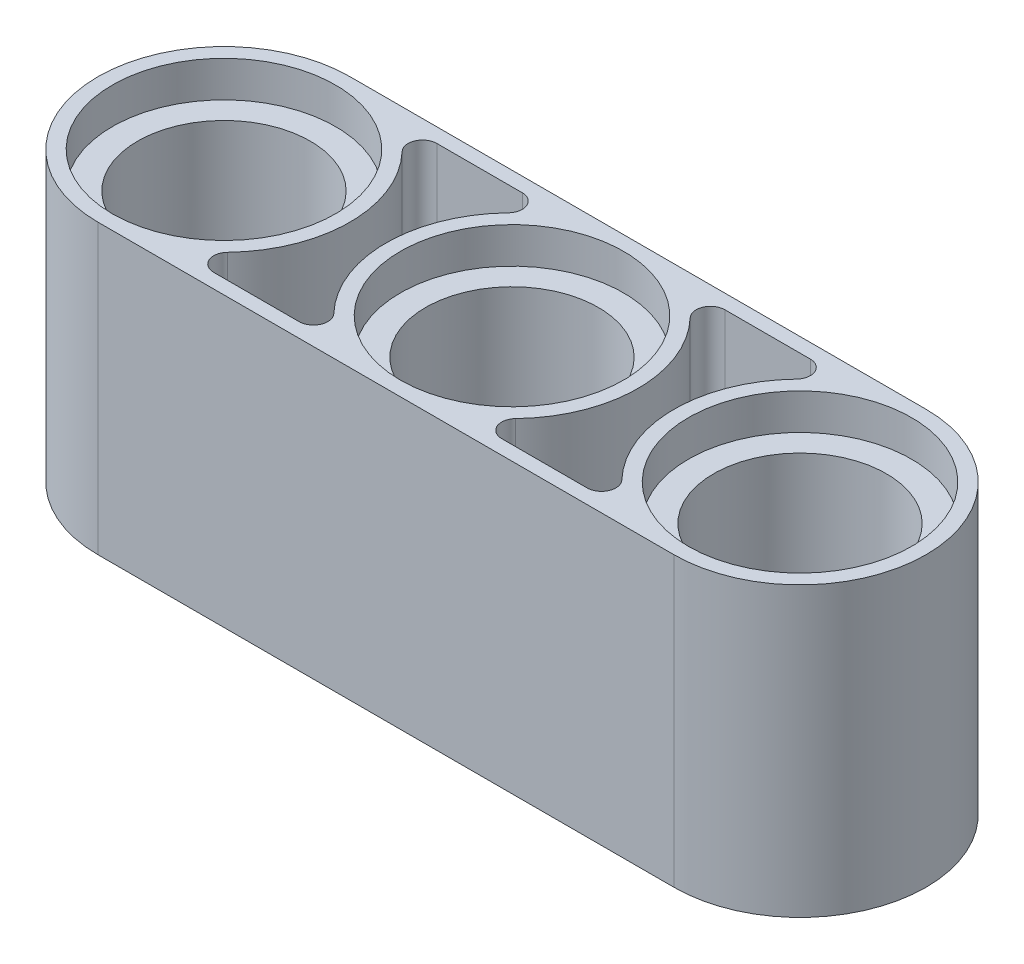
ISO-10303-21;
HEADER;
FILE_DESCRIPTION(('STEP AP214'),'2;1');
FILE_NAME('part.step','',(''),(''),'','','');
FILE_SCHEMA(('AUTOMOTIVE_DESIGN { 1 0 10303 214 1 1 1 1 }'));
ENDSEC;
DATA;
#1=APPLICATION_CONTEXT('core data for automotive mechanical design processes');
#2=APPLICATION_PROTOCOL_DEFINITION('international standard','automotive_design',2000,#1);
#3=PRODUCT_CONTEXT('',#1,'mechanical');
#4=PRODUCT('Part','Part','',(#3));
#5=PRODUCT_RELATED_PRODUCT_CATEGORY('part','',(#4));
#6=PRODUCT_DEFINITION_FORMATION('','',#4);
#7=PRODUCT_DEFINITION_CONTEXT('part definition',#1,'design');
#8=PRODUCT_DEFINITION('design','',#6,#7);
#9=PRODUCT_DEFINITION_SHAPE('','',#8);
#10=(LENGTH_UNIT() NAMED_UNIT(*) SI_UNIT(.MILLI.,.METRE.));
#11=(NAMED_UNIT(*) PLANE_ANGLE_UNIT() SI_UNIT($,.RADIAN.));
#12=(NAMED_UNIT(*) SI_UNIT($,.STERADIAN.) SOLID_ANGLE_UNIT());
#13=UNCERTAINTY_MEASURE_WITH_UNIT(LENGTH_MEASURE(1.E-05),#10,'distance_accuracy_value','');
#14=(GEOMETRIC_REPRESENTATION_CONTEXT(3) GLOBAL_UNCERTAINTY_ASSIGNED_CONTEXT((#13)) GLOBAL_UNIT_ASSIGNED_CONTEXT((#10,
#11,#12)) REPRESENTATION_CONTEXT('',''));
#15=CARTESIAN_POINT('',(0.,0.,0.));
#16=DIRECTION('',(0.,0.,1.));
#17=DIRECTION('',(1.,0.,0.));
#18=AXIS2_PLACEMENT_3D('',#15,#16,#17);
#19=CARTESIAN_POINT('',(8.,-4.,0.));
#20=DIRECTION('',(0.,1.,0.));
#21=DIRECTION('',(0.,0.,1.));
#22=AXIS2_PLACEMENT_3D('',#19,#20,#21);
#23=CYLINDRICAL_SURFACE('',#22,2.4);
#24=CARTESIAN_POINT('',(8.,3.,0.));
#25=DIRECTION('',(0.,1.,0.));
#26=DIRECTION('',(0.,0.,1.));
#27=AXIS2_PLACEMENT_3D('',#24,#25,#26);
#28=CIRCLE('',#27,2.4);
#29=CARTESIAN_POINT('',(8.,3.,2.4));
#30=VERTEX_POINT('',#29);
#31=EDGE_CURVE('E379',#30,#30,#28,.T.);
#32=ORIENTED_EDGE('',*,*,#31,.T.);
#33=EDGE_LOOP('',(#32));
#34=FACE_BOUND('',#33,.T.);
#35=CARTESIAN_POINT('',(8.,-3.,0.));
#36=DIRECTION('',(0.,-1.,0.));
#37=DIRECTION('',(0.,0.,-1.));
#38=AXIS2_PLACEMENT_3D('',#35,#36,#37);
#39=CIRCLE('',#38,2.4);
#40=CARTESIAN_POINT('',(8.,-3.,-2.4));
#41=VERTEX_POINT('',#40);
#42=EDGE_CURVE('E42',#41,#41,#39,.F.);
#43=ORIENTED_EDGE('',*,*,#42,.F.);
#44=EDGE_LOOP('',(#43));
#45=FACE_BOUND('',#44,.T.);
#46=ADVANCED_FACE('F38',(#34,#45),#23,.F.);
#47=CARTESIAN_POINT('',(16.,-4.,0.));
#48=DIRECTION('',(0.,1.,0.));
#49=DIRECTION('',(0.,0.,1.));
#50=AXIS2_PLACEMENT_3D('',#47,#48,#49);
#51=CYLINDRICAL_SURFACE('',#50,2.4);
#52=CARTESIAN_POINT('',(16.,3.,0.));
#53=DIRECTION('',(0.,1.,0.));
#54=DIRECTION('',(0.,0.,1.));
#55=AXIS2_PLACEMENT_3D('',#52,#53,#54);
#56=CIRCLE('',#55,2.4);
#57=CARTESIAN_POINT('',(16.,3.,2.4));
#58=VERTEX_POINT('',#57);
#59=EDGE_CURVE('E335',#58,#58,#56,.T.);
#60=ORIENTED_EDGE('',*,*,#59,.T.);
#61=EDGE_LOOP('',(#60));
#62=FACE_BOUND('',#61,.T.);
#63=CARTESIAN_POINT('',(16.,-3.,0.));
#64=DIRECTION('',(0.,-1.,0.));
#65=DIRECTION('',(0.,0.,-1.));
#66=AXIS2_PLACEMENT_3D('',#63,#64,#65);
#67=CIRCLE('',#66,2.4);
#68=CARTESIAN_POINT('',(16.,-3.,-2.4));
#69=VERTEX_POINT('',#68);
#70=EDGE_CURVE('E313',#69,#69,#67,.F.);
#71=ORIENTED_EDGE('',*,*,#70,.F.);
#72=EDGE_LOOP('',(#71));
#73=FACE_BOUND('',#72,.T.);
#74=ADVANCED_FACE('F392',(#62,#73),#51,.F.);
#75=CARTESIAN_POINT('',(0.,-4.,0.));
#76=DIRECTION('',(0.,1.,0.));
#77=DIRECTION('',(0.,0.,1.));
#78=AXIS2_PLACEMENT_3D('',#75,#76,#77);
#79=CYLINDRICAL_SURFACE('',#78,2.4);
#80=CARTESIAN_POINT('',(0.,3.,0.));
#81=DIRECTION('',(0.,1.,0.));
#82=DIRECTION('',(0.,0.,1.));
#83=AXIS2_PLACEMENT_3D('',#80,#81,#82);
#84=CIRCLE('',#83,2.4);
#85=CARTESIAN_POINT('',(0.,3.,2.4));
#86=VERTEX_POINT('',#85);
#87=EDGE_CURVE('E349',#86,#86,#84,.T.);
#88=ORIENTED_EDGE('',*,*,#87,.T.);
#89=EDGE_LOOP('',(#88));
#90=FACE_BOUND('',#89,.T.);
#91=CARTESIAN_POINT('',(0.,-3.,0.));
#92=DIRECTION('',(0.,-1.,0.));
#93=DIRECTION('',(0.,0.,-1.));
#94=AXIS2_PLACEMENT_3D('',#91,#92,#93);
#95=CIRCLE('',#94,2.4);
#96=CARTESIAN_POINT('',(0.,-3.,-2.4));
#97=VERTEX_POINT('',#96);
#98=EDGE_CURVE('E339',#97,#97,#95,.F.);
#99=ORIENTED_EDGE('',*,*,#98,.F.);
#100=EDGE_LOOP('',(#99));
#101=FACE_BOUND('',#100,.T.);
#102=ADVANCED_FACE('F398',(#90,#101),#79,.F.);
#103=CARTESIAN_POINT('',(0.,4.,0.));
#104=DIRECTION('',(0.,-1.,0.));
#105=DIRECTION('',(0.,0.,-1.));
#106=AXIS2_PLACEMENT_3D('',#103,#104,#105);
#107=CYLINDRICAL_SURFACE('',#106,3.5);
#108=CARTESIAN_POINT('',(0.,-4.,0.));
#109=DIRECTION('',(0.,1.,0.));
#110=DIRECTION('',(0.,0.,1.));
#111=AXIS2_PLACEMENT_3D('',#108,#109,#110);
#112=CIRCLE('',#111,3.5);
#113=CARTESIAN_POINT('',(0.,-4.,-3.5));
#114=VERTEX_POINT('',#113);
#115=CARTESIAN_POINT('',(0.,-4.,3.5));
#116=VERTEX_POINT('',#115);
#117=EDGE_CURVE('E345',#114,#116,#112,.T.);
#118=ORIENTED_EDGE('',*,*,#117,.T.);
#119=DIRECTION('',(0.,-1.,0.));
#120=VECTOR('',#119,1.);
#121=CARTESIAN_POINT('',(0.,4.,3.5));
#122=LINE('',#121,#120);
#123=CARTESIAN_POINT('',(0.,4.,3.5));
#124=VERTEX_POINT('',#123);
#125=EDGE_CURVE('E11',#124,#116,#122,.T.);
#126=ORIENTED_EDGE('',*,*,#125,.F.);
#127=CARTESIAN_POINT('',(0.,4.,0.));
#128=DIRECTION('',(0.,1.,0.));
#129=DIRECTION('',(0.,0.,1.));
#130=AXIS2_PLACEMENT_3D('',#127,#128,#129);
#131=CIRCLE('',#130,3.5);
#132=CARTESIAN_POINT('',(0.,4.,-3.5));
#133=VERTEX_POINT('',#132);
#134=EDGE_CURVE('E350',#133,#124,#131,.T.);
#135=ORIENTED_EDGE('',*,*,#134,.F.);
#136=DIRECTION('',(0.,-1.,0.));
#137=VECTOR('',#136,1.);
#138=CARTESIAN_POINT('',(0.,4.,-3.5));
#139=LINE('',#138,#137);
#140=EDGE_CURVE('E360',#133,#114,#139,.T.);
#141=ORIENTED_EDGE('',*,*,#140,.T.);
#142=EDGE_LOOP('',(#118,#126,#135,#141));
#143=FACE_BOUND('',#142,.T.);
#144=ADVANCED_FACE('F40',(#143),#107,.T.);
#145=CARTESIAN_POINT('',(0.,4.,3.5));
#146=DIRECTION('',(0.,0.,-1.));
#147=DIRECTION('',(-1.,0.,0.));
#148=AXIS2_PLACEMENT_3D('',#145,#146,#147);
#149=PLANE('',#148);
#150=DIRECTION('',(1.,0.,0.));
#151=VECTOR('',#150,1.);
#152=CARTESIAN_POINT('',(0.,-4.,3.5));
#153=LINE('',#152,#151);
#154=CARTESIAN_POINT('',(16.,-4.,3.5));
#155=VERTEX_POINT('',#154);
#156=EDGE_CURVE('E363',#116,#155,#153,.T.);
#157=ORIENTED_EDGE('',*,*,#156,.T.);
#158=DIRECTION('',(0.,-1.,0.));
#159=VECTOR('',#158,1.);
#160=CARTESIAN_POINT('',(16.,4.,3.5));
#161=LINE('',#160,#159);
#162=CARTESIAN_POINT('',(16.,4.,3.5));
#163=VERTEX_POINT('',#162);
#164=EDGE_CURVE('E47',#163,#155,#161,.T.);
#165=ORIENTED_EDGE('',*,*,#164,.F.);
#166=DIRECTION('',(1.,0.,0.));
#167=VECTOR('',#166,1.);
#168=CARTESIAN_POINT('',(0.,4.,3.5));
#169=LINE('',#168,#167);
#170=EDGE_CURVE('E353',#124,#163,#169,.T.);
#171=ORIENTED_EDGE('',*,*,#170,.F.);
#172=ORIENTED_EDGE('',*,*,#125,.T.);
#173=EDGE_LOOP('',(#157,#165,#171,#172));
#174=FACE_BOUND('',#173,.T.);
#175=ADVANCED_FACE('F453',(#174),#149,.F.);
#176=CARTESIAN_POINT('',(16.,4.,0.));
#177=DIRECTION('',(0.,-1.,0.));
#178=DIRECTION('',(0.,0.,-1.));
#179=AXIS2_PLACEMENT_3D('',#176,#177,#178);
#180=CYLINDRICAL_SURFACE('',#179,3.5);
#181=CARTESIAN_POINT('',(16.,-4.,0.));
#182=DIRECTION('',(0.,1.,0.));
#183=DIRECTION('',(0.,0.,1.));
#184=AXIS2_PLACEMENT_3D('',#181,#182,#183);
#185=CIRCLE('',#184,3.5);
#186=CARTESIAN_POINT('',(16.,-4.,-3.5));
#187=VERTEX_POINT('',#186);
#188=EDGE_CURVE('E365',#155,#187,#185,.T.);
#189=ORIENTED_EDGE('',*,*,#188,.T.);
#190=DIRECTION('',(0.,-1.,0.));
#191=VECTOR('',#190,1.);
#192=CARTESIAN_POINT('',(16.,4.,-3.5));
#193=LINE('',#192,#191);
#194=CARTESIAN_POINT('',(16.,4.,-3.5));
#195=VERTEX_POINT('',#194);
#196=EDGE_CURVE('E370',#195,#187,#193,.T.);
#197=ORIENTED_EDGE('',*,*,#196,.F.);
#198=CARTESIAN_POINT('',(16.,4.,0.));
#199=DIRECTION('',(0.,1.,0.));
#200=DIRECTION('',(0.,0.,1.));
#201=AXIS2_PLACEMENT_3D('',#198,#199,#200);
#202=CIRCLE('',#201,3.5);
#203=EDGE_CURVE('E356',#163,#195,#202,.T.);
#204=ORIENTED_EDGE('',*,*,#203,.F.);
#205=ORIENTED_EDGE('',*,*,#164,.T.);
#206=EDGE_LOOP('',(#189,#197,#204,#205));
#207=FACE_BOUND('',#206,.T.);
#208=ADVANCED_FACE('F450',(#207),#180,.T.);
#209=CARTESIAN_POINT('',(0.,4.,-3.5));
#210=DIRECTION('',(0.,0.,1.));
#211=DIRECTION('',(1.,0.,0.));
#212=AXIS2_PLACEMENT_3D('',#209,#210,#211);
#213=PLANE('',#212);
#214=DIRECTION('',(-1.,0.,0.));
#215=VECTOR('',#214,1.);
#216=CARTESIAN_POINT('',(0.,-4.,-3.5));
#217=LINE('',#216,#215);
#218=EDGE_CURVE('E354',#187,#114,#217,.T.);
#219=ORIENTED_EDGE('',*,*,#218,.T.);
#220=ORIENTED_EDGE('',*,*,#140,.F.);
#221=DIRECTION('',(-1.,0.,0.));
#222=VECTOR('',#221,1.);
#223=CARTESIAN_POINT('',(0.,4.,-3.5));
#224=LINE('',#223,#222);
#225=EDGE_CURVE('E358',#195,#133,#224,.T.);
#226=ORIENTED_EDGE('',*,*,#225,.F.);
#227=ORIENTED_EDGE('',*,*,#196,.T.);
#228=EDGE_LOOP('',(#219,#220,#226,#227));
#229=FACE_BOUND('',#228,.T.);
#230=ADVANCED_FACE('F444',(#229),#213,.F.);
#231=CARTESIAN_POINT('',(0.,4.,0.));
#232=DIRECTION('',(0.,1.,0.));
#233=DIRECTION('',(0.,0.,1.));
#234=AXIS2_PLACEMENT_3D('',#231,#232,#233);
#235=PLANE('',#234);
#236=CARTESIAN_POINT('',(10.8142494558941,4.,2.7));
#237=DIRECTION('',(0.,1.,0.));
#238=DIRECTION('',(0.,0.,1.));
#239=AXIS2_PLACEMENT_3D('',#236,#237,#238);
#240=CIRCLE('',#239,0.4);
#241=CARTESIAN_POINT('',(10.5256084860588,4.,2.42307692307692));
#242=VERTEX_POINT('',#241);
#243=CARTESIAN_POINT('',(10.8142494558941,4.,3.1));
#244=VERTEX_POINT('',#243);
#245=EDGE_CURVE('E55',#242,#244,#240,.T.);
#246=ORIENTED_EDGE('',*,*,#245,.F.);
#247=CARTESIAN_POINT('',(8.,4.,0.));
#248=DIRECTION('',(0.,-1.,0.));
#249=DIRECTION('',(0.,0.,1.));
#250=AXIS2_PLACEMENT_3D('',#247,#248,#249);
#251=CIRCLE('',#250,3.5);
#252=CARTESIAN_POINT('',(10.5256084860588,4.,-2.42307692307692));
#253=VERTEX_POINT('',#252);
#254=EDGE_CURVE('E196',#253,#242,#251,.T.);
#255=ORIENTED_EDGE('',*,*,#254,.F.);
#256=CARTESIAN_POINT('',(10.8142494558941,4.,-2.7));
#257=DIRECTION('',(0.,1.,0.));
#258=DIRECTION('',(0.,0.,-1.));
#259=AXIS2_PLACEMENT_3D('',#256,#257,#258);
#260=CIRCLE('',#259,0.4);
#261=CARTESIAN_POINT('',(10.8142494558941,4.,-3.1));
#262=VERTEX_POINT('',#261);
#263=EDGE_CURVE('E199',#262,#253,#260,.T.);
#264=ORIENTED_EDGE('',*,*,#263,.F.);
#265=DIRECTION('',(-1.,0.,0.));
#266=VECTOR('',#265,1.);
#267=CARTESIAN_POINT('',(10.8142494558941,4.,-3.1));
#268=LINE('',#267,#266);
#269=CARTESIAN_POINT('',(13.1857505441059,4.,-3.1));
#270=VERTEX_POINT('',#269);
#271=EDGE_CURVE('E227',#270,#262,#268,.T.);
#272=ORIENTED_EDGE('',*,*,#271,.F.);
#273=CARTESIAN_POINT('',(13.1857505441059,4.,-2.7));
#274=DIRECTION('',(0.,1.,0.));
#275=DIRECTION('',(0.,0.,-1.));
#276=AXIS2_PLACEMENT_3D('',#273,#274,#275);
#277=CIRCLE('',#276,0.4);
#278=CARTESIAN_POINT('',(13.4743915139412,4.,-2.42307692307692));
#279=VERTEX_POINT('',#278);
#280=EDGE_CURVE('E224',#279,#270,#277,.T.);
#281=ORIENTED_EDGE('',*,*,#280,.F.);
#282=CARTESIAN_POINT('',(16.,4.,0.));
#283=DIRECTION('',(0.,-1.,0.));
#284=DIRECTION('',(0.,0.,1.));
#285=AXIS2_PLACEMENT_3D('',#282,#283,#284);
#286=CIRCLE('',#285,3.5);
#287=CARTESIAN_POINT('',(13.4743915139412,4.,2.42307692307692));
#288=VERTEX_POINT('',#287);
#289=EDGE_CURVE('E221',#288,#279,#286,.T.);
#290=ORIENTED_EDGE('',*,*,#289,.F.);
#291=CARTESIAN_POINT('',(13.1857505441059,4.,2.7));
#292=DIRECTION('',(0.,1.,0.));
#293=DIRECTION('',(0.,0.,1.));
#294=AXIS2_PLACEMENT_3D('',#291,#292,#293);
#295=CIRCLE('',#294,0.4);
#296=CARTESIAN_POINT('',(13.1857505441059,4.,3.1));
#297=VERTEX_POINT('',#296);
#298=EDGE_CURVE('E218',#297,#288,#295,.T.);
#299=ORIENTED_EDGE('',*,*,#298,.F.);
#300=DIRECTION('',(1.,0.,0.));
#301=VECTOR('',#300,1.);
#302=CARTESIAN_POINT('',(10.8142494558941,4.,3.1));
#303=LINE('',#302,#301);
#304=EDGE_CURVE('E216',#244,#297,#303,.T.);
#305=ORIENTED_EDGE('',*,*,#304,.F.);
#306=EDGE_LOOP('',(#246,#255,#264,#272,#281,#290,#299,#305));
#307=FACE_BOUND('',#306,.T.);
#308=CARTESIAN_POINT('',(2.81424945589406,4.,2.7));
#309=DIRECTION('',(0.,1.,0.));
#310=DIRECTION('',(0.,0.,1.));
#311=AXIS2_PLACEMENT_3D('',#308,#309,#310);
#312=CIRCLE('',#311,0.4);
#313=CARTESIAN_POINT('',(2.52560848605877,4.,2.42307692307692));
#314=VERTEX_POINT('',#313);
#315=CARTESIAN_POINT('',(2.81424945589406,4.,3.1));
#316=VERTEX_POINT('',#315);
#317=EDGE_CURVE('E234',#314,#316,#312,.T.);
#318=ORIENTED_EDGE('',*,*,#317,.F.);
#319=CARTESIAN_POINT('',(0.,4.,0.));
#320=DIRECTION('',(0.,-1.,0.));
#321=DIRECTION('',(0.,0.,1.));
#322=AXIS2_PLACEMENT_3D('',#319,#320,#321);
#323=CIRCLE('',#322,3.5);
#324=CARTESIAN_POINT('',(2.52560848605877,4.,-2.42307692307692));
#325=VERTEX_POINT('',#324);
#326=EDGE_CURVE('E250',#325,#314,#323,.T.);
#327=ORIENTED_EDGE('',*,*,#326,.F.);
#328=CARTESIAN_POINT('',(2.81424945589406,4.,-2.7));
#329=DIRECTION('',(0.,1.,0.));
#330=DIRECTION('',(0.,0.,-1.));
#331=AXIS2_PLACEMENT_3D('',#328,#329,#330);
#332=CIRCLE('',#331,0.4);
#333=CARTESIAN_POINT('',(2.81424945589406,4.,-3.1));
#334=VERTEX_POINT('',#333);
#335=EDGE_CURVE('E288',#334,#325,#332,.T.);
#336=ORIENTED_EDGE('',*,*,#335,.F.);
#337=DIRECTION('',(-1.,0.,0.));
#338=VECTOR('',#337,1.);
#339=CARTESIAN_POINT('',(2.81424945589406,4.,-3.1));
#340=LINE('',#339,#338);
#341=CARTESIAN_POINT('',(5.18575054410594,4.,-3.1));
#342=VERTEX_POINT('',#341);
#343=EDGE_CURVE('E285',#342,#334,#340,.T.);
#344=ORIENTED_EDGE('',*,*,#343,.F.);
#345=CARTESIAN_POINT('',(5.18575054410594,4.,-2.7));
#346=DIRECTION('',(0.,1.,0.));
#347=DIRECTION('',(0.,0.,-1.));
#348=AXIS2_PLACEMENT_3D('',#345,#346,#347);
#349=CIRCLE('',#348,0.4);
#350=CARTESIAN_POINT('',(5.47439151394123,4.,-2.42307692307692));
#351=VERTEX_POINT('',#350);
#352=EDGE_CURVE('E282',#351,#342,#349,.T.);
#353=ORIENTED_EDGE('',*,*,#352,.F.);
#354=CARTESIAN_POINT('',(8.,4.,0.));
#355=DIRECTION('',(0.,-1.,0.));
#356=DIRECTION('',(0.,0.,1.));
#357=AXIS2_PLACEMENT_3D('',#354,#355,#356);
#358=CIRCLE('',#357,3.5);
#359=CARTESIAN_POINT('',(5.47439151394123,4.,2.42307692307692));
#360=VERTEX_POINT('',#359);
#361=EDGE_CURVE('E279',#360,#351,#358,.T.);
#362=ORIENTED_EDGE('',*,*,#361,.F.);
#363=CARTESIAN_POINT('',(5.18575054410594,4.,2.7));
#364=DIRECTION('',(0.,1.,0.));
#365=DIRECTION('',(0.,0.,1.));
#366=AXIS2_PLACEMENT_3D('',#363,#364,#365);
#367=CIRCLE('',#366,0.4);
#368=CARTESIAN_POINT('',(5.18575054410594,4.,3.1));
#369=VERTEX_POINT('',#368);
#370=EDGE_CURVE('E276',#369,#360,#367,.T.);
#371=ORIENTED_EDGE('',*,*,#370,.F.);
#372=DIRECTION('',(1.,0.,0.));
#373=VECTOR('',#372,1.);
#374=CARTESIAN_POINT('',(2.81424945589406,4.,3.1));
#375=LINE('',#374,#373);
#376=EDGE_CURVE('E273',#316,#369,#375,.T.);
#377=ORIENTED_EDGE('',*,*,#376,.F.);
#378=EDGE_LOOP('',(#318,#327,#336,#344,#353,#362,#371,#377));
#379=FACE_BOUND('',#378,.T.);
#380=CARTESIAN_POINT('',(8.,4.,0.));
#381=DIRECTION('',(0.,1.,0.));
#382=DIRECTION('',(0.,0.,1.));
#383=AXIS2_PLACEMENT_3D('',#380,#381,#382);
#384=CIRCLE('',#383,3.1);
#385=CARTESIAN_POINT('',(8.,4.,3.1));
#386=VERTEX_POINT('',#385);
#387=EDGE_CURVE('E326',#386,#386,#384,.T.);
#388=ORIENTED_EDGE('',*,*,#387,.F.);
#389=EDGE_LOOP('',(#388));
#390=FACE_BOUND('',#389,.T.);
#391=CARTESIAN_POINT('',(16.,4.,0.));
#392=DIRECTION('',(0.,1.,0.));
#393=DIRECTION('',(0.,0.,1.));
#394=AXIS2_PLACEMENT_3D('',#391,#392,#393);
#395=CIRCLE('',#394,3.1);
#396=CARTESIAN_POINT('',(16.,4.,3.1));
#397=VERTEX_POINT('',#396);
#398=EDGE_CURVE('E332',#397,#397,#395,.T.);
#399=ORIENTED_EDGE('',*,*,#398,.F.);
#400=EDGE_LOOP('',(#399));
#401=FACE_BOUND('',#400,.T.);
#402=CARTESIAN_POINT('',(0.,4.,0.));
#403=DIRECTION('',(0.,1.,0.));
#404=DIRECTION('',(0.,0.,1.));
#405=AXIS2_PLACEMENT_3D('',#402,#403,#404);
#406=CIRCLE('',#405,3.1);
#407=CARTESIAN_POINT('',(0.,4.,3.1));
#408=VERTEX_POINT('',#407);
#409=EDGE_CURVE('E346',#408,#408,#406,.T.);
#410=ORIENTED_EDGE('',*,*,#409,.F.);
#411=EDGE_LOOP('',(#410));
#412=FACE_BOUND('',#411,.T.);
#413=ORIENTED_EDGE('',*,*,#134,.T.);
#414=ORIENTED_EDGE('',*,*,#170,.T.);
#415=ORIENTED_EDGE('',*,*,#203,.T.);
#416=ORIENTED_EDGE('',*,*,#225,.T.);
#417=EDGE_LOOP('',(#413,#414,#415,#416));
#418=FACE_BOUND('',#417,.T.);
#419=ADVANCED_FACE('F441',(#307,#379,#390,#401,#412,#418),#235,.T.);
#420=CARTESIAN_POINT('',(0.,-4.,0.));
#421=DIRECTION('',(0.,1.,0.));
#422=DIRECTION('',(0.,0.,1.));
#423=AXIS2_PLACEMENT_3D('',#420,#421,#422);
#424=PLANE('',#423);
#425=CARTESIAN_POINT('',(8.,-4.,0.));
#426=DIRECTION('',(0.,-1.,0.));
#427=DIRECTION('',(0.,0.,1.));
#428=AXIS2_PLACEMENT_3D('',#425,#426,#427);
#429=CIRCLE('',#428,3.5);
#430=CARTESIAN_POINT('',(10.5256084860588,-4.,-2.42307692307692));
#431=VERTEX_POINT('',#430);
#432=CARTESIAN_POINT('',(10.5256084860588,-4.,2.42307692307692));
#433=VERTEX_POINT('',#432);
#434=EDGE_CURVE('E185',#431,#433,#429,.T.);
#435=ORIENTED_EDGE('',*,*,#434,.T.);
#436=CARTESIAN_POINT('',(10.8142494558941,-4.,2.7));
#437=DIRECTION('',(0.,1.,0.));
#438=DIRECTION('',(0.,0.,1.));
#439=AXIS2_PLACEMENT_3D('',#436,#437,#438);
#440=CIRCLE('',#439,0.4);
#441=CARTESIAN_POINT('',(10.8142494558941,-4.,3.1));
#442=VERTEX_POINT('',#441);
#443=EDGE_CURVE('E179',#433,#442,#440,.T.);
#444=ORIENTED_EDGE('',*,*,#443,.T.);
#445=DIRECTION('',(1.,0.,0.));
#446=VECTOR('',#445,1.);
#447=CARTESIAN_POINT('',(10.8142494558941,-4.,3.1));
#448=LINE('',#447,#446);
#449=CARTESIAN_POINT('',(13.1857505441059,-4.,3.1));
#450=VERTEX_POINT('',#449);
#451=EDGE_CURVE('E188',#442,#450,#448,.T.);
#452=ORIENTED_EDGE('',*,*,#451,.T.);
#453=CARTESIAN_POINT('',(13.1857505441059,-4.,2.7));
#454=DIRECTION('',(0.,1.,0.));
#455=DIRECTION('',(0.,0.,1.));
#456=AXIS2_PLACEMENT_3D('',#453,#454,#455);
#457=CIRCLE('',#456,0.4);
#458=CARTESIAN_POINT('',(13.4743915139412,-4.,2.42307692307692));
#459=VERTEX_POINT('',#458);
#460=EDGE_CURVE('E63',#450,#459,#457,.T.);
#461=ORIENTED_EDGE('',*,*,#460,.T.);
#462=CARTESIAN_POINT('',(16.,-4.,0.));
#463=DIRECTION('',(0.,-1.,0.));
#464=DIRECTION('',(0.,0.,1.));
#465=AXIS2_PLACEMENT_3D('',#462,#463,#464);
#466=CIRCLE('',#465,3.5);
#467=CARTESIAN_POINT('',(13.4743915139412,-4.,-2.42307692307692));
#468=VERTEX_POINT('',#467);
#469=EDGE_CURVE('E203',#459,#468,#466,.T.);
#470=ORIENTED_EDGE('',*,*,#469,.T.);
#471=CARTESIAN_POINT('',(13.1857505441059,-4.,-2.7));
#472=DIRECTION('',(0.,1.,0.));
#473=DIRECTION('',(0.,0.,-1.));
#474=AXIS2_PLACEMENT_3D('',#471,#472,#473);
#475=CIRCLE('',#474,0.4);
#476=CARTESIAN_POINT('',(13.1857505441059,-4.,-3.1));
#477=VERTEX_POINT('',#476);
#478=EDGE_CURVE('E206',#468,#477,#475,.T.);
#479=ORIENTED_EDGE('',*,*,#478,.T.);
#480=DIRECTION('',(-1.,0.,0.));
#481=VECTOR('',#480,1.);
#482=CARTESIAN_POINT('',(10.8142494558941,-4.,-3.1));
#483=LINE('',#482,#481);
#484=CARTESIAN_POINT('',(10.8142494558941,-4.,-3.1));
#485=VERTEX_POINT('',#484);
#486=EDGE_CURVE('E209',#477,#485,#483,.T.);
#487=ORIENTED_EDGE('',*,*,#486,.T.);
#488=CARTESIAN_POINT('',(10.8142494558941,-4.,-2.7));
#489=DIRECTION('',(0.,1.,0.));
#490=DIRECTION('',(0.,0.,-1.));
#491=AXIS2_PLACEMENT_3D('',#488,#489,#490);
#492=CIRCLE('',#491,0.4);
#493=EDGE_CURVE('E212',#485,#431,#492,.T.);
#494=ORIENTED_EDGE('',*,*,#493,.T.);
#495=EDGE_LOOP('',(#435,#444,#452,#461,#470,#479,#487,#494));
#496=FACE_BOUND('',#495,.T.);
#497=CARTESIAN_POINT('',(0.,-4.,0.));
#498=DIRECTION('',(0.,-1.,0.));
#499=DIRECTION('',(0.,0.,1.));
#500=AXIS2_PLACEMENT_3D('',#497,#498,#499);
#501=CIRCLE('',#500,3.5);
#502=CARTESIAN_POINT('',(2.52560848605877,-4.,-2.42307692307692));
#503=VERTEX_POINT('',#502);
#504=CARTESIAN_POINT('',(2.52560848605877,-4.,2.42307692307692));
#505=VERTEX_POINT('',#504);
#506=EDGE_CURVE('E268',#503,#505,#501,.T.);
#507=ORIENTED_EDGE('',*,*,#506,.T.);
#508=CARTESIAN_POINT('',(2.81424945589406,-4.,2.7));
#509=DIRECTION('',(0.,1.,0.));
#510=DIRECTION('',(0.,0.,1.));
#511=AXIS2_PLACEMENT_3D('',#508,#509,#510);
#512=CIRCLE('',#511,0.4);
#513=CARTESIAN_POINT('',(2.81424945589406,-4.,3.1));
#514=VERTEX_POINT('',#513);
#515=EDGE_CURVE('E246',#505,#514,#512,.T.);
#516=ORIENTED_EDGE('',*,*,#515,.T.);
#517=DIRECTION('',(1.,0.,0.));
#518=VECTOR('',#517,1.);
#519=CARTESIAN_POINT('',(2.81424945589406,-4.,3.1));
#520=LINE('',#519,#518);
#521=CARTESIAN_POINT('',(5.18575054410594,-4.,3.1));
#522=VERTEX_POINT('',#521);
#523=EDGE_CURVE('E249',#514,#522,#520,.T.);
#524=ORIENTED_EDGE('',*,*,#523,.T.);
#525=CARTESIAN_POINT('',(5.18575054410594,-4.,2.7));
#526=DIRECTION('',(0.,1.,0.));
#527=DIRECTION('',(0.,0.,1.));
#528=AXIS2_PLACEMENT_3D('',#525,#526,#527);
#529=CIRCLE('',#528,0.4);
#530=CARTESIAN_POINT('',(5.47439151394123,-4.,2.42307692307692));
#531=VERTEX_POINT('',#530);
#532=EDGE_CURVE('E253',#522,#531,#529,.T.);
#533=ORIENTED_EDGE('',*,*,#532,.T.);
#534=CARTESIAN_POINT('',(8.,-4.,0.));
#535=DIRECTION('',(0.,-1.,0.));
#536=DIRECTION('',(0.,0.,1.));
#537=AXIS2_PLACEMENT_3D('',#534,#535,#536);
#538=CIRCLE('',#537,3.5);
#539=CARTESIAN_POINT('',(5.47439151394123,-4.,-2.42307692307692));
#540=VERTEX_POINT('',#539);
#541=EDGE_CURVE('E256',#531,#540,#538,.T.);
#542=ORIENTED_EDGE('',*,*,#541,.T.);
#543=CARTESIAN_POINT('',(5.18575054410594,-4.,-2.7));
#544=DIRECTION('',(0.,1.,0.));
#545=DIRECTION('',(0.,0.,-1.));
#546=AXIS2_PLACEMENT_3D('',#543,#544,#545);
#547=CIRCLE('',#546,0.4);
#548=CARTESIAN_POINT('',(5.18575054410594,-4.,-3.1));
#549=VERTEX_POINT('',#548);
#550=EDGE_CURVE('E259',#540,#549,#547,.T.);
#551=ORIENTED_EDGE('',*,*,#550,.T.);
#552=DIRECTION('',(-1.,0.,0.));
#553=VECTOR('',#552,1.);
#554=CARTESIAN_POINT('',(2.81424945589406,-4.,-3.1));
#555=LINE('',#554,#553);
#556=CARTESIAN_POINT('',(2.81424945589406,-4.,-3.1));
#557=VERTEX_POINT('',#556);
#558=EDGE_CURVE('E262',#549,#557,#555,.T.);
#559=ORIENTED_EDGE('',*,*,#558,.T.);
#560=CARTESIAN_POINT('',(2.81424945589406,-4.,-2.7));
#561=DIRECTION('',(0.,1.,0.));
#562=DIRECTION('',(0.,0.,-1.));
#563=AXIS2_PLACEMENT_3D('',#560,#561,#562);
#564=CIRCLE('',#563,0.4);
#565=EDGE_CURVE('E265',#557,#503,#564,.T.);
#566=ORIENTED_EDGE('',*,*,#565,.T.);
#567=EDGE_LOOP('',(#507,#516,#524,#533,#542,#551,#559,#566));
#568=FACE_BOUND('',#567,.T.);
#569=CARTESIAN_POINT('',(8.,-4.,0.));
#570=DIRECTION('',(0.,-1.,0.));
#571=DIRECTION('',(0.,0.,-1.));
#572=AXIS2_PLACEMENT_3D('',#569,#570,#571);
#573=CIRCLE('',#572,3.1);
#574=CARTESIAN_POINT('',(8.,-4.,-3.1));
#575=VERTEX_POINT('',#574);
#576=EDGE_CURVE('E314',#575,#575,#573,.T.);
#577=ORIENTED_EDGE('',*,*,#576,.F.);
#578=EDGE_LOOP('',(#577));
#579=FACE_BOUND('',#578,.T.);
#580=CARTESIAN_POINT('',(16.,-4.,0.));
#581=DIRECTION('',(0.,-1.,0.));
#582=DIRECTION('',(0.,0.,-1.));
#583=AXIS2_PLACEMENT_3D('',#580,#581,#582);
#584=CIRCLE('',#583,3.1);
#585=CARTESIAN_POINT('',(16.,-4.,-3.1));
#586=VERTEX_POINT('',#585);
#587=EDGE_CURVE('E295',#586,#586,#584,.T.);
#588=ORIENTED_EDGE('',*,*,#587,.F.);
#589=EDGE_LOOP('',(#588));
#590=FACE_BOUND('',#589,.T.);
#591=CARTESIAN_POINT('',(0.,-4.,0.));
#592=DIRECTION('',(0.,-1.,0.));
#593=DIRECTION('',(0.,0.,-1.));
#594=AXIS2_PLACEMENT_3D('',#591,#592,#593);
#595=CIRCLE('',#594,3.1);
#596=CARTESIAN_POINT('',(0.,-4.,-3.1));
#597=VERTEX_POINT('',#596);
#598=EDGE_CURVE('E325',#597,#597,#595,.T.);
#599=ORIENTED_EDGE('',*,*,#598,.F.);
#600=EDGE_LOOP('',(#599));
#601=FACE_BOUND('',#600,.T.);
#602=ORIENTED_EDGE('',*,*,#117,.F.);
#603=ORIENTED_EDGE('',*,*,#218,.F.);
#604=ORIENTED_EDGE('',*,*,#188,.F.);
#605=ORIENTED_EDGE('',*,*,#156,.F.);
#606=EDGE_LOOP('',(#602,#603,#604,#605));
#607=FACE_BOUND('',#606,.T.);
#608=ADVANCED_FACE('F192',(#496,#568,#579,#590,#601,#607),#424,.F.);
#609=CARTESIAN_POINT('',(0.,3.,0.));
#610=DIRECTION('',(0.,1.,0.));
#611=DIRECTION('',(0.,0.,1.));
#612=AXIS2_PLACEMENT_3D('',#609,#610,#611);
#613=CYLINDRICAL_SURFACE('',#612,3.1);
#614=CARTESIAN_POINT('',(0.,3.,0.));
#615=DIRECTION('',(0.,1.,0.));
#616=DIRECTION('',(0.,0.,1.));
#617=AXIS2_PLACEMENT_3D('',#614,#615,#616);
#618=CIRCLE('',#617,3.1);
#619=CARTESIAN_POINT('',(0.,3.,3.1));
#620=VERTEX_POINT('',#619);
#621=EDGE_CURVE('E342',#620,#620,#618,.T.);
#622=ORIENTED_EDGE('',*,*,#621,.F.);
#623=EDGE_LOOP('',(#622));
#624=FACE_BOUND('',#623,.T.);
#625=ORIENTED_EDGE('',*,*,#409,.T.);
#626=EDGE_LOOP('',(#625));
#627=FACE_BOUND('',#626,.T.);
#628=ADVANCED_FACE('F436',(#624,#627),#613,.F.);
#629=CARTESIAN_POINT('',(0.,3.,0.));
#630=DIRECTION('',(0.,1.,0.));
#631=DIRECTION('',(0.,0.,1.));
#632=AXIS2_PLACEMENT_3D('',#629,#630,#631);
#633=PLANE('',#632);
#634=ORIENTED_EDGE('',*,*,#87,.F.);
#635=EDGE_LOOP('',(#634));
#636=FACE_BOUND('',#635,.T.);
#637=ORIENTED_EDGE('',*,*,#621,.T.);
#638=EDGE_LOOP('',(#637));
#639=FACE_BOUND('',#638,.T.);
#640=ADVANCED_FACE('F426',(#636,#639),#633,.T.);
#641=CARTESIAN_POINT('',(0.,-3.,0.));
#642=DIRECTION('',(0.,-1.,0.));
#643=DIRECTION('',(0.,0.,-1.));
#644=AXIS2_PLACEMENT_3D('',#641,#642,#643);
#645=PLANE('',#644);
#646=CARTESIAN_POINT('',(0.,-3.,0.));
#647=DIRECTION('',(0.,-1.,0.));
#648=DIRECTION('',(0.,0.,-1.));
#649=AXIS2_PLACEMENT_3D('',#646,#647,#648);
#650=CIRCLE('',#649,3.1);
#651=CARTESIAN_POINT('',(0.,-3.,-3.1));
#652=VERTEX_POINT('',#651);
#653=EDGE_CURVE('E336',#652,#652,#650,.T.);
#654=ORIENTED_EDGE('',*,*,#653,.T.);
#655=EDGE_LOOP('',(#654));
#656=FACE_BOUND('',#655,.T.);
#657=ORIENTED_EDGE('',*,*,#98,.T.);
#658=EDGE_LOOP('',(#657));
#659=FACE_BOUND('',#658,.T.);
#660=ADVANCED_FACE('F423',(#656,#659),#645,.T.);
#661=CARTESIAN_POINT('',(0.,-3.,0.));
#662=DIRECTION('',(0.,-1.,0.));
#663=DIRECTION('',(0.,0.,-1.));
#664=AXIS2_PLACEMENT_3D('',#661,#662,#663);
#665=CYLINDRICAL_SURFACE('',#664,3.1);
#666=ORIENTED_EDGE('',*,*,#653,.F.);
#667=EDGE_LOOP('',(#666));
#668=FACE_BOUND('',#667,.T.);
#669=ORIENTED_EDGE('',*,*,#598,.T.);
#670=EDGE_LOOP('',(#669));
#671=FACE_BOUND('',#670,.T.);
#672=ADVANCED_FACE('F421',(#668,#671),#665,.F.);
#673=CARTESIAN_POINT('',(16.,3.,0.));
#674=DIRECTION('',(0.,1.,0.));
#675=DIRECTION('',(0.,0.,1.));
#676=AXIS2_PLACEMENT_3D('',#673,#674,#675);
#677=CYLINDRICAL_SURFACE('',#676,3.1);
#678=CARTESIAN_POINT('',(16.,3.,0.));
#679=DIRECTION('',(0.,1.,0.));
#680=DIRECTION('',(0.,0.,1.));
#681=AXIS2_PLACEMENT_3D('',#678,#679,#680);
#682=CIRCLE('',#681,3.1);
#683=CARTESIAN_POINT('',(16.,3.,3.1));
#684=VERTEX_POINT('',#683);
#685=EDGE_CURVE('E329',#684,#684,#682,.T.);
#686=ORIENTED_EDGE('',*,*,#685,.F.);
#687=EDGE_LOOP('',(#686));
#688=FACE_BOUND('',#687,.T.);
#689=ORIENTED_EDGE('',*,*,#398,.T.);
#690=EDGE_LOOP('',(#689));
#691=FACE_BOUND('',#690,.T.);
#692=ADVANCED_FACE('F417',(#688,#691),#677,.F.);
#693=CARTESIAN_POINT('',(16.,3.,0.));
#694=DIRECTION('',(0.,1.,0.));
#695=DIRECTION('',(0.,0.,1.));
#696=AXIS2_PLACEMENT_3D('',#693,#694,#695);
#697=PLANE('',#696);
#698=ORIENTED_EDGE('',*,*,#59,.F.);
#699=EDGE_LOOP('',(#698));
#700=FACE_BOUND('',#699,.T.);
#701=ORIENTED_EDGE('',*,*,#685,.T.);
#702=EDGE_LOOP('',(#701));
#703=FACE_BOUND('',#702,.T.);
#704=ADVANCED_FACE('F413',(#700,#703),#697,.T.);
#705=CARTESIAN_POINT('',(8.,3.,0.));
#706=DIRECTION('',(0.,1.,0.));
#707=DIRECTION('',(0.,0.,1.));
#708=AXIS2_PLACEMENT_3D('',#705,#706,#707);
#709=CYLINDRICAL_SURFACE('',#708,3.1);
#710=CARTESIAN_POINT('',(8.,3.,0.));
#711=DIRECTION('',(0.,1.,0.));
#712=DIRECTION('',(0.,0.,1.));
#713=AXIS2_PLACEMENT_3D('',#710,#711,#712);
#714=CIRCLE('',#713,3.1);
#715=CARTESIAN_POINT('',(8.,3.,3.1));
#716=VERTEX_POINT('',#715);
#717=EDGE_CURVE('E322',#716,#716,#714,.T.);
#718=ORIENTED_EDGE('',*,*,#717,.F.);
#719=EDGE_LOOP('',(#718));
#720=FACE_BOUND('',#719,.T.);
#721=ORIENTED_EDGE('',*,*,#387,.T.);
#722=EDGE_LOOP('',(#721));
#723=FACE_BOUND('',#722,.T.);
#724=ADVANCED_FACE('F409',(#720,#723),#709,.F.);
#725=CARTESIAN_POINT('',(8.,3.,0.));
#726=DIRECTION('',(0.,1.,0.));
#727=DIRECTION('',(0.,0.,1.));
#728=AXIS2_PLACEMENT_3D('',#725,#726,#727);
#729=PLANE('',#728);
#730=ORIENTED_EDGE('',*,*,#31,.F.);
#731=EDGE_LOOP('',(#730));
#732=FACE_BOUND('',#731,.T.);
#733=ORIENTED_EDGE('',*,*,#717,.T.);
#734=EDGE_LOOP('',(#733));
#735=FACE_BOUND('',#734,.T.);
#736=ADVANCED_FACE('F405',(#732,#735),#729,.T.);
#737=CARTESIAN_POINT('',(16.,-3.,0.));
#738=DIRECTION('',(0.,-1.,0.));
#739=DIRECTION('',(0.,0.,-1.));
#740=AXIS2_PLACEMENT_3D('',#737,#738,#739);
#741=PLANE('',#740);
#742=CARTESIAN_POINT('',(16.,-3.,0.));
#743=DIRECTION('',(0.,-1.,0.));
#744=DIRECTION('',(0.,0.,-1.));
#745=AXIS2_PLACEMENT_3D('',#742,#743,#744);
#746=CIRCLE('',#745,3.1);
#747=CARTESIAN_POINT('',(16.,-3.,-3.1));
#748=VERTEX_POINT('',#747);
#749=EDGE_CURVE('E317',#748,#748,#746,.T.);
#750=ORIENTED_EDGE('',*,*,#749,.T.);
#751=EDGE_LOOP('',(#750));
#752=FACE_BOUND('',#751,.T.);
#753=ORIENTED_EDGE('',*,*,#70,.T.);
#754=EDGE_LOOP('',(#753));
#755=FACE_BOUND('',#754,.T.);
#756=ADVANCED_FACE('F408',(#752,#755),#741,.T.);
#757=CARTESIAN_POINT('',(16.,-3.,0.));
#758=DIRECTION('',(0.,-1.,0.));
#759=DIRECTION('',(0.,0.,-1.));
#760=AXIS2_PLACEMENT_3D('',#757,#758,#759);
#761=CYLINDRICAL_SURFACE('',#760,3.1);
#762=ORIENTED_EDGE('',*,*,#749,.F.);
#763=EDGE_LOOP('',(#762));
#764=FACE_BOUND('',#763,.T.);
#765=ORIENTED_EDGE('',*,*,#587,.T.);
#766=EDGE_LOOP('',(#765));
#767=FACE_BOUND('',#766,.T.);
#768=ADVANCED_FACE('F402',(#764,#767),#761,.F.);
#769=CARTESIAN_POINT('',(8.,-3.,0.));
#770=DIRECTION('',(0.,-1.,0.));
#771=DIRECTION('',(0.,0.,-1.));
#772=AXIS2_PLACEMENT_3D('',#769,#770,#771);
#773=PLANE('',#772);
#774=CARTESIAN_POINT('',(8.,-3.,0.));
#775=DIRECTION('',(0.,-1.,0.));
#776=DIRECTION('',(0.,0.,-1.));
#777=AXIS2_PLACEMENT_3D('',#774,#775,#776);
#778=CIRCLE('',#777,3.1);
#779=CARTESIAN_POINT('',(8.,-3.,-3.1));
#780=VERTEX_POINT('',#779);
#781=EDGE_CURVE('E310',#780,#780,#778,.T.);
#782=ORIENTED_EDGE('',*,*,#781,.T.);
#783=EDGE_LOOP('',(#782));
#784=FACE_BOUND('',#783,.T.);
#785=ORIENTED_EDGE('',*,*,#42,.T.);
#786=EDGE_LOOP('',(#785));
#787=FACE_BOUND('',#786,.T.);
#788=ADVANCED_FACE('F389',(#784,#787),#773,.T.);
#789=CARTESIAN_POINT('',(8.,-3.,0.));
#790=DIRECTION('',(0.,-1.,0.));
#791=DIRECTION('',(0.,0.,-1.));
#792=AXIS2_PLACEMENT_3D('',#789,#790,#791);
#793=CYLINDRICAL_SURFACE('',#792,3.1);
#794=ORIENTED_EDGE('',*,*,#781,.F.);
#795=EDGE_LOOP('',(#794));
#796=FACE_BOUND('',#795,.T.);
#797=ORIENTED_EDGE('',*,*,#576,.T.);
#798=EDGE_LOOP('',(#797));
#799=FACE_BOUND('',#798,.T.);
#800=ADVANCED_FACE('F538',(#796,#799),#793,.F.);
#801=CARTESIAN_POINT('',(2.81424945589406,-4.,2.7));
#802=DIRECTION('',(0.,1.,0.));
#803=DIRECTION('',(0.,0.,1.));
#804=AXIS2_PLACEMENT_3D('',#801,#802,#803);
#805=CYLINDRICAL_SURFACE('',#804,0.4);
#806=ORIENTED_EDGE('',*,*,#317,.T.);
#807=DIRECTION('',(0.,1.,0.));
#808=VECTOR('',#807,1.);
#809=CARTESIAN_POINT('',(2.81424945589406,-4.,3.1));
#810=LINE('',#809,#808);
#811=EDGE_CURVE('E271',#514,#316,#810,.T.);
#812=ORIENTED_EDGE('',*,*,#811,.F.);
#813=ORIENTED_EDGE('',*,*,#515,.F.);
#814=DIRECTION('',(0.,1.,0.));
#815=VECTOR('',#814,1.);
#816=CARTESIAN_POINT('',(2.52560848605877,-4.,2.42307692307692));
#817=LINE('',#816,#815);
#818=EDGE_CURVE('E293',#505,#314,#817,.T.);
#819=ORIENTED_EDGE('',*,*,#818,.T.);
#820=EDGE_LOOP('',(#806,#812,#813,#819));
#821=FACE_BOUND('',#820,.T.);
#822=ADVANCED_FACE('F548',(#821),#805,.F.);
#823=CARTESIAN_POINT('',(0.,-4.,0.));
#824=DIRECTION('',(0.,1.,0.));
#825=DIRECTION('',(0.,0.,1.));
#826=AXIS2_PLACEMENT_3D('',#823,#824,#825);
#827=CYLINDRICAL_SURFACE('',#826,3.5);
#828=ORIENTED_EDGE('',*,*,#326,.T.);
#829=ORIENTED_EDGE('',*,*,#818,.F.);
#830=ORIENTED_EDGE('',*,*,#506,.F.);
#831=DIRECTION('',(0.,1.,0.));
#832=VECTOR('',#831,1.);
#833=CARTESIAN_POINT('',(2.52560848605877,-4.,-2.42307692307692));
#834=LINE('',#833,#832);
#835=EDGE_CURVE('E296',#503,#325,#834,.T.);
#836=ORIENTED_EDGE('',*,*,#835,.T.);
#837=EDGE_LOOP('',(#828,#829,#830,#836));
#838=FACE_BOUND('',#837,.T.);
#839=ADVANCED_FACE('F558',(#838),#827,.T.);
#840=CARTESIAN_POINT('',(2.81424945589406,-4.,-2.7));
#841=DIRECTION('',(0.,1.,0.));
#842=DIRECTION('',(0.,0.,1.));
#843=AXIS2_PLACEMENT_3D('',#840,#841,#842);
#844=CYLINDRICAL_SURFACE('',#843,0.4);
#845=ORIENTED_EDGE('',*,*,#335,.T.);
#846=ORIENTED_EDGE('',*,*,#835,.F.);
#847=ORIENTED_EDGE('',*,*,#565,.F.);
#848=DIRECTION('',(0.,1.,0.));
#849=VECTOR('',#848,1.);
#850=CARTESIAN_POINT('',(2.81424945589406,-4.,-3.1));
#851=LINE('',#850,#849);
#852=EDGE_CURVE('E298',#557,#334,#851,.T.);
#853=ORIENTED_EDGE('',*,*,#852,.T.);
#854=EDGE_LOOP('',(#845,#846,#847,#853));
#855=FACE_BOUND('',#854,.T.);
#856=ADVANCED_FACE('F568',(#855),#844,.F.);
#857=CARTESIAN_POINT('',(2.81424945589406,-4.,-3.1));
#858=DIRECTION('',(0.,0.,-1.));
#859=DIRECTION('',(-1.,0.,0.));
#860=AXIS2_PLACEMENT_3D('',#857,#858,#859);
#861=PLANE('',#860);
#862=ORIENTED_EDGE('',*,*,#343,.T.);
#863=ORIENTED_EDGE('',*,*,#852,.F.);
#864=ORIENTED_EDGE('',*,*,#558,.F.);
#865=DIRECTION('',(0.,1.,0.));
#866=VECTOR('',#865,1.);
#867=CARTESIAN_POINT('',(5.18575054410594,-4.,-3.1));
#868=LINE('',#867,#866);
#869=EDGE_CURVE('E300',#549,#342,#868,.T.);
#870=ORIENTED_EDGE('',*,*,#869,.T.);
#871=EDGE_LOOP('',(#862,#863,#864,#870));
#872=FACE_BOUND('',#871,.T.);
#873=ADVANCED_FACE('F578',(#872),#861,.F.);
#874=CARTESIAN_POINT('',(5.18575054410594,-4.,-2.7));
#875=DIRECTION('',(0.,1.,0.));
#876=DIRECTION('',(0.,0.,1.));
#877=AXIS2_PLACEMENT_3D('',#874,#875,#876);
#878=CYLINDRICAL_SURFACE('',#877,0.4);
#879=ORIENTED_EDGE('',*,*,#352,.T.);
#880=ORIENTED_EDGE('',*,*,#869,.F.);
#881=ORIENTED_EDGE('',*,*,#550,.F.);
#882=DIRECTION('',(0.,1.,0.));
#883=VECTOR('',#882,1.);
#884=CARTESIAN_POINT('',(5.47439151394123,-4.,-2.42307692307692));
#885=LINE('',#884,#883);
#886=EDGE_CURVE('E302',#540,#351,#885,.T.);
#887=ORIENTED_EDGE('',*,*,#886,.T.);
#888=EDGE_LOOP('',(#879,#880,#881,#887));
#889=FACE_BOUND('',#888,.T.);
#890=ADVANCED_FACE('F588',(#889),#878,.F.);
#891=CARTESIAN_POINT('',(8.,-4.,0.));
#892=DIRECTION('',(0.,1.,0.));
#893=DIRECTION('',(0.,0.,1.));
#894=AXIS2_PLACEMENT_3D('',#891,#892,#893);
#895=CYLINDRICAL_SURFACE('',#894,3.5);
#896=ORIENTED_EDGE('',*,*,#361,.T.);
#897=ORIENTED_EDGE('',*,*,#886,.F.);
#898=ORIENTED_EDGE('',*,*,#541,.F.);
#899=DIRECTION('',(0.,1.,0.));
#900=VECTOR('',#899,1.);
#901=CARTESIAN_POINT('',(5.47439151394123,-4.,2.42307692307692));
#902=LINE('',#901,#900);
#903=EDGE_CURVE('E304',#531,#360,#902,.T.);
#904=ORIENTED_EDGE('',*,*,#903,.T.);
#905=EDGE_LOOP('',(#896,#897,#898,#904));
#906=FACE_BOUND('',#905,.T.);
#907=ADVANCED_FACE('F598',(#906),#895,.T.);
#908=CARTESIAN_POINT('',(5.18575054410594,-4.,2.7));
#909=DIRECTION('',(0.,1.,0.));
#910=DIRECTION('',(0.,0.,1.));
#911=AXIS2_PLACEMENT_3D('',#908,#909,#910);
#912=CYLINDRICAL_SURFACE('',#911,0.4);
#913=ORIENTED_EDGE('',*,*,#370,.T.);
#914=ORIENTED_EDGE('',*,*,#903,.F.);
#915=ORIENTED_EDGE('',*,*,#532,.F.);
#916=DIRECTION('',(0.,1.,0.));
#917=VECTOR('',#916,1.);
#918=CARTESIAN_POINT('',(5.18575054410594,-4.,3.1));
#919=LINE('',#918,#917);
#920=EDGE_CURVE('E306',#522,#369,#919,.T.);
#921=ORIENTED_EDGE('',*,*,#920,.T.);
#922=EDGE_LOOP('',(#913,#914,#915,#921));
#923=FACE_BOUND('',#922,.T.);
#924=ADVANCED_FACE('F608',(#923),#912,.F.);
#925=CARTESIAN_POINT('',(2.81424945589406,-4.,3.1));
#926=DIRECTION('',(0.,0.,1.));
#927=DIRECTION('',(1.,0.,0.));
#928=AXIS2_PLACEMENT_3D('',#925,#926,#927);
#929=PLANE('',#928);
#930=ORIENTED_EDGE('',*,*,#376,.T.);
#931=ORIENTED_EDGE('',*,*,#920,.F.);
#932=ORIENTED_EDGE('',*,*,#523,.F.);
#933=ORIENTED_EDGE('',*,*,#811,.T.);
#934=EDGE_LOOP('',(#930,#931,#932,#933));
#935=FACE_BOUND('',#934,.T.);
#936=ADVANCED_FACE('F618',(#935),#929,.F.);
#937=CARTESIAN_POINT('',(10.8142494558941,-4.,2.7));
#938=DIRECTION('',(0.,1.,0.));
#939=DIRECTION('',(0.,0.,1.));
#940=AXIS2_PLACEMENT_3D('',#937,#938,#939);
#941=CYLINDRICAL_SURFACE('',#940,0.4);
#942=ORIENTED_EDGE('',*,*,#245,.T.);
#943=DIRECTION('',(0.,1.,0.));
#944=VECTOR('',#943,1.);
#945=CARTESIAN_POINT('',(10.8142494558941,-4.,3.1));
#946=LINE('',#945,#944);
#947=EDGE_CURVE('E175',#442,#244,#946,.T.);
#948=ORIENTED_EDGE('',*,*,#947,.F.);
#949=ORIENTED_EDGE('',*,*,#443,.F.);
#950=DIRECTION('',(0.,1.,0.));
#951=VECTOR('',#950,1.);
#952=CARTESIAN_POINT('',(10.5256084860588,-4.,2.42307692307692));
#953=LINE('',#952,#951);
#954=EDGE_CURVE('E232',#433,#242,#953,.T.);
#955=ORIENTED_EDGE('',*,*,#954,.T.);
#956=EDGE_LOOP('',(#942,#948,#949,#955));
#957=FACE_BOUND('',#956,.T.);
#958=ADVANCED_FACE('F177',(#957),#941,.F.);
#959=CARTESIAN_POINT('',(8.,-4.,0.));
#960=DIRECTION('',(0.,1.,0.));
#961=DIRECTION('',(0.,0.,1.));
#962=AXIS2_PLACEMENT_3D('',#959,#960,#961);
#963=CYLINDRICAL_SURFACE('',#962,3.5);
#964=ORIENTED_EDGE('',*,*,#254,.T.);
#965=ORIENTED_EDGE('',*,*,#954,.F.);
#966=ORIENTED_EDGE('',*,*,#434,.F.);
#967=DIRECTION('',(0.,1.,0.));
#968=VECTOR('',#967,1.);
#969=CARTESIAN_POINT('',(10.5256084860588,-4.,-2.42307692307692));
#970=LINE('',#969,#968);
#971=EDGE_CURVE('E235',#431,#253,#970,.T.);
#972=ORIENTED_EDGE('',*,*,#971,.T.);
#973=EDGE_LOOP('',(#964,#965,#966,#972));
#974=FACE_BOUND('',#973,.T.);
#975=ADVANCED_FACE('F649',(#974),#963,.T.);
#976=CARTESIAN_POINT('',(10.8142494558941,-4.,-2.7));
#977=DIRECTION('',(0.,1.,0.));
#978=DIRECTION('',(0.,0.,1.));
#979=AXIS2_PLACEMENT_3D('',#976,#977,#978);
#980=CYLINDRICAL_SURFACE('',#979,0.4);
#981=ORIENTED_EDGE('',*,*,#263,.T.);
#982=ORIENTED_EDGE('',*,*,#971,.F.);
#983=ORIENTED_EDGE('',*,*,#493,.F.);
#984=DIRECTION('',(0.,1.,0.));
#985=VECTOR('',#984,1.);
#986=CARTESIAN_POINT('',(10.8142494558941,-4.,-3.1));
#987=LINE('',#986,#985);
#988=EDGE_CURVE('E237',#485,#262,#987,.T.);
#989=ORIENTED_EDGE('',*,*,#988,.T.);
#990=EDGE_LOOP('',(#981,#982,#983,#989));
#991=FACE_BOUND('',#990,.T.);
#992=ADVANCED_FACE('F658',(#991),#980,.F.);
#993=CARTESIAN_POINT('',(10.8142494558941,-4.,-3.1));
#994=DIRECTION('',(0.,0.,-1.));
#995=DIRECTION('',(-1.,0.,0.));
#996=AXIS2_PLACEMENT_3D('',#993,#994,#995);
#997=PLANE('',#996);
#998=ORIENTED_EDGE('',*,*,#271,.T.);
#999=ORIENTED_EDGE('',*,*,#988,.F.);
#1000=ORIENTED_EDGE('',*,*,#486,.F.);
#1001=DIRECTION('',(0.,1.,0.));
#1002=VECTOR('',#1001,1.);
#1003=CARTESIAN_POINT('',(13.1857505441059,-4.,-3.1));
#1004=LINE('',#1003,#1002);
#1005=EDGE_CURVE('E239',#477,#270,#1004,.T.);
#1006=ORIENTED_EDGE('',*,*,#1005,.T.);
#1007=EDGE_LOOP('',(#998,#999,#1000,#1006));
#1008=FACE_BOUND('',#1007,.T.);
#1009=ADVANCED_FACE('F668',(#1008),#997,.F.);
#1010=CARTESIAN_POINT('',(13.1857505441059,-4.,-2.7));
#1011=DIRECTION('',(0.,1.,0.));
#1012=DIRECTION('',(0.,0.,1.));
#1013=AXIS2_PLACEMENT_3D('',#1010,#1011,#1012);
#1014=CYLINDRICAL_SURFACE('',#1013,0.4);
#1015=ORIENTED_EDGE('',*,*,#280,.T.);
#1016=ORIENTED_EDGE('',*,*,#1005,.F.);
#1017=ORIENTED_EDGE('',*,*,#478,.F.);
#1018=DIRECTION('',(0.,1.,0.));
#1019=VECTOR('',#1018,1.);
#1020=CARTESIAN_POINT('',(13.4743915139412,-4.,-2.42307692307692));
#1021=LINE('',#1020,#1019);
#1022=EDGE_CURVE('E241',#468,#279,#1021,.T.);
#1023=ORIENTED_EDGE('',*,*,#1022,.T.);
#1024=EDGE_LOOP('',(#1015,#1016,#1017,#1023));
#1025=FACE_BOUND('',#1024,.T.);
#1026=ADVANCED_FACE('F678',(#1025),#1014,.F.);
#1027=CARTESIAN_POINT('',(16.,-4.,0.));
#1028=DIRECTION('',(0.,1.,0.));
#1029=DIRECTION('',(0.,0.,1.));
#1030=AXIS2_PLACEMENT_3D('',#1027,#1028,#1029);
#1031=CYLINDRICAL_SURFACE('',#1030,3.5);
#1032=ORIENTED_EDGE('',*,*,#289,.T.);
#1033=ORIENTED_EDGE('',*,*,#1022,.F.);
#1034=ORIENTED_EDGE('',*,*,#469,.F.);
#1035=DIRECTION('',(0.,1.,0.));
#1036=VECTOR('',#1035,1.);
#1037=CARTESIAN_POINT('',(13.4743915139412,-4.,2.42307692307692));
#1038=LINE('',#1037,#1036);
#1039=EDGE_CURVE('E243',#459,#288,#1038,.T.);
#1040=ORIENTED_EDGE('',*,*,#1039,.T.);
#1041=EDGE_LOOP('',(#1032,#1033,#1034,#1040));
#1042=FACE_BOUND('',#1041,.T.);
#1043=ADVANCED_FACE('F688',(#1042),#1031,.T.);
#1044=CARTESIAN_POINT('',(13.1857505441059,-4.,2.7));
#1045=DIRECTION('',(0.,1.,0.));
#1046=DIRECTION('',(0.,0.,1.));
#1047=AXIS2_PLACEMENT_3D('',#1044,#1045,#1046);
#1048=CYLINDRICAL_SURFACE('',#1047,0.4);
#1049=ORIENTED_EDGE('',*,*,#298,.T.);
#1050=ORIENTED_EDGE('',*,*,#1039,.F.);
#1051=ORIENTED_EDGE('',*,*,#460,.F.);
#1052=DIRECTION('',(0.,1.,0.));
#1053=VECTOR('',#1052,1.);
#1054=CARTESIAN_POINT('',(13.1857505441059,-4.,3.1));
#1055=LINE('',#1054,#1053);
#1056=EDGE_CURVE('E184',#450,#297,#1055,.T.);
#1057=ORIENTED_EDGE('',*,*,#1056,.T.);
#1058=EDGE_LOOP('',(#1049,#1050,#1051,#1057));
#1059=FACE_BOUND('',#1058,.T.);
#1060=ADVANCED_FACE('F698',(#1059),#1048,.F.);
#1061=CARTESIAN_POINT('',(10.8142494558941,-4.,3.1));
#1062=DIRECTION('',(0.,0.,1.));
#1063=DIRECTION('',(1.,0.,0.));
#1064=AXIS2_PLACEMENT_3D('',#1061,#1062,#1063);
#1065=PLANE('',#1064);
#1066=ORIENTED_EDGE('',*,*,#304,.T.);
#1067=ORIENTED_EDGE('',*,*,#1056,.F.);
#1068=ORIENTED_EDGE('',*,*,#451,.F.);
#1069=ORIENTED_EDGE('',*,*,#947,.T.);
#1070=EDGE_LOOP('',(#1066,#1067,#1068,#1069));
#1071=FACE_BOUND('',#1070,.T.);
#1072=ADVANCED_FACE('F189',(#1071),#1065,.F.);
#1073=CLOSED_SHELL('',(#46,#74,#102,#144,#175,#208,#230,#419,#608,#628,#640,#660,#672,#692,#704,
#724,#736,#756,#768,#788,#800,#822,#839,#856,#873,#890,#907,#924,#936,#958,#975,#992,#1009,
#1026,#1043,#1060,#1072));
#1074=MANIFOLD_SOLID_BREP('B2',#1073);
#1075=ADVANCED_BREP_SHAPE_REPRESENTATION('',(#18,#1074),#14);
#1076=SHAPE_DEFINITION_REPRESENTATION(#9,#1075);
ENDSEC;
END-ISO-10303-21;
